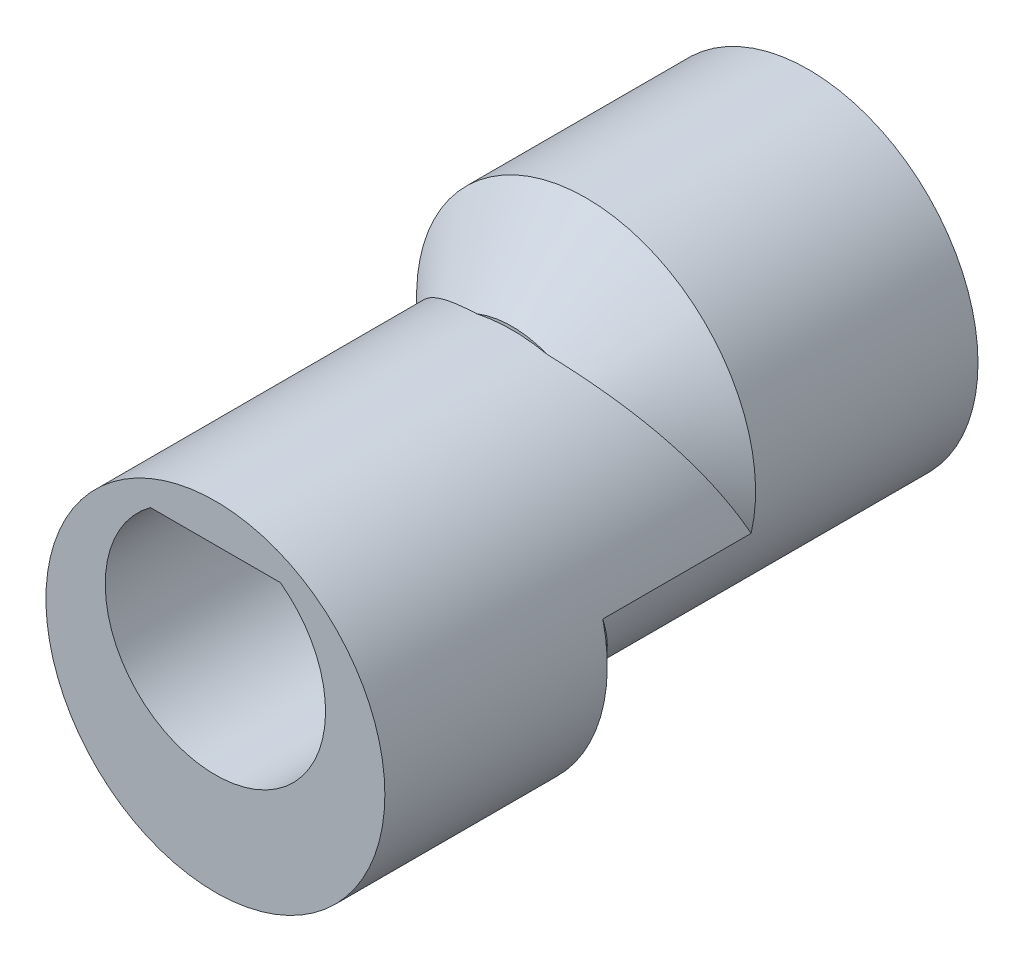
ISO-10303-21;
HEADER;
FILE_DESCRIPTION(('STEP AP214'),'2;1');
FILE_NAME('part.step','',(''),(''),'','','');
FILE_SCHEMA(('AUTOMOTIVE_DESIGN { 1 0 10303 214 1 1 1 1 }'));
ENDSEC;
DATA;
#1=APPLICATION_CONTEXT('core data for automotive mechanical design processes');
#2=APPLICATION_PROTOCOL_DEFINITION('international standard','automotive_design',2000,#1);
#3=PRODUCT_CONTEXT('',#1,'mechanical');
#4=PRODUCT('Part','Part','',(#3));
#5=PRODUCT_RELATED_PRODUCT_CATEGORY('part','',(#4));
#6=PRODUCT_DEFINITION_FORMATION('','',#4);
#7=PRODUCT_DEFINITION_CONTEXT('part definition',#1,'design');
#8=PRODUCT_DEFINITION('design','',#6,#7);
#9=PRODUCT_DEFINITION_SHAPE('','',#8);
#10=(LENGTH_UNIT() NAMED_UNIT(*) SI_UNIT(.MILLI.,.METRE.));
#11=(NAMED_UNIT(*) PLANE_ANGLE_UNIT() SI_UNIT($,.RADIAN.));
#12=(NAMED_UNIT(*) SI_UNIT($,.STERADIAN.) SOLID_ANGLE_UNIT());
#13=UNCERTAINTY_MEASURE_WITH_UNIT(LENGTH_MEASURE(1.E-05),#10,'distance_accuracy_value','');
#14=(GEOMETRIC_REPRESENTATION_CONTEXT(3) GLOBAL_UNCERTAINTY_ASSIGNED_CONTEXT((#13)) GLOBAL_UNIT_ASSIGNED_CONTEXT((#10,
#11,#12)) REPRESENTATION_CONTEXT('',''));
#15=CARTESIAN_POINT('',(0.,0.,0.));
#16=DIRECTION('',(0.,0.,1.));
#17=DIRECTION('',(1.,0.,0.));
#18=AXIS2_PLACEMENT_3D('',#15,#16,#17);
#19=CARTESIAN_POINT('',(0.,0.822072072072072,7.));
#20=DIRECTION('',(0.,0.,-1.));
#21=DIRECTION('',(-1.,0.,0.));
#22=AXIS2_PLACEMENT_3D('',#19,#20,#21);
#23=CYLINDRICAL_SURFACE('',#22,4.);
#24=CARTESIAN_POINT('',(0.,0.822072072072072,7.));
#25=DIRECTION('',(0.,0.,1.));
#26=DIRECTION('',(1.,0.,0.));
#27=AXIS2_PLACEMENT_3D('',#24,#25,#26);
#28=CIRCLE('',#27,4.);
#29=CARTESIAN_POINT('',(-0.832416826561857,-3.09035456965,7.));
#30=VERTEX_POINT('',#29);
#31=CARTESIAN_POINT('',(0.832416826561857,-3.09035456965,7.));
#32=VERTEX_POINT('',#31);
#33=EDGE_CURVE('E126',#30,#32,#28,.T.);
#34=ORIENTED_EDGE('',*,*,#33,.F.);
#35=CARTESIAN_POINT('',(-0.832416826561859,-3.09035456965,7.));
#36=CARTESIAN_POINT('',(-0.928283112962649,-3.06996119736182,7.01651059702666));
#37=CARTESIAN_POINT('',(-1.02289258695509,-3.04614512237589,7.03561942137898));
#38=CARTESIAN_POINT('',(-1.20909359386115,-2.9920435632729,7.07835176839966));
#39=CARTESIAN_POINT('',(-1.30068814168173,-2.96176478361378,7.10197060968749));
#40=CARTESIAN_POINT('',(-1.56947440841262,-2.86209877848865,7.17834381647651));
#41=CARTESIAN_POINT('',(-1.74175685502727,-2.78364402787083,7.23681585373251));
#42=CARTESIAN_POINT('',(-2.0779143594082,-2.60144986224845,7.36697500086163));
#43=CARTESIAN_POINT('',(-2.24106500081024,-2.49673363584971,7.43913745432706));
#44=CARTESIAN_POINT('',(-2.54883249725891,-2.26668666188954,7.59074588528036));
#45=CARTESIAN_POINT('',(-2.69341002483402,-2.14131341424269,7.67020672622366));
#46=CARTESIAN_POINT('',(-2.98907543887914,-1.84577692198815,7.84959275576821));
#47=CARTESIAN_POINT('',(-3.1356802439645,-1.67167082236258,7.95043192755659));
#48=CARTESIAN_POINT('',(-3.39684252708479,-1.30220910340953,8.15428576356132));
#49=CARTESIAN_POINT('',(-3.51142019835684,-1.10686698189474,8.25729901274184));
#50=CARTESIAN_POINT('',(-3.67088036612868,-0.773360208952291,8.42563317432922));
#51=CARTESIAN_POINT('',(-3.72598282228731,-0.640063734032256,8.49111344983434));
#52=CARTESIAN_POINT('',(-3.82151563065921,-0.368199923437119,8.62126290483657));
#53=CARTESIAN_POINT('',(-3.86196748324567,-0.229640644049144,8.68593313734113));
#54=CARTESIAN_POINT('',(-3.89487013147342,-0.088963963963964,8.75));
#55=B_SPLINE_CURVE_WITH_KNOTS('',3,(#35,#36,#37,#38,#39,#40,#41,#42,#43,#44,#45,#46,#47,#48,#49,
#50,#51,#52,#53,#54),.UNSPECIFIED.,.F.,.F.,(4,2,2,2,2,2,2,2,2,4),(0.,0.297945292975673,
0.595582984689978,1.18750437414797,1.805993153621,2.42577068629197,3.16952850456355,
3.91281631729058,4.38731643902962,4.86111736304012),.UNSPECIFIED.);
#56=CARTESIAN_POINT('',(-3.89487013147342,-0.0889639639639639,8.75));
#57=VERTEX_POINT('',#56);
#58=EDGE_CURVE('E11',#30,#57,#55,.T.);
#59=ORIENTED_EDGE('',*,*,#58,.T.);
#60=DIRECTION('',(0.,0.,-1.));
#61=VECTOR('',#60,1.);
#62=CARTESIAN_POINT('',(-3.89487013147342,-0.0889639639639639,7.));
#63=LINE('',#62,#61);
#64=CARTESIAN_POINT('',(-3.89487013147342,-0.0889639639639639,5.25));
#65=VERTEX_POINT('',#64);
#66=EDGE_CURVE('E138',#57,#65,#63,.T.);
#67=ORIENTED_EDGE('',*,*,#66,.T.);
#68=CARTESIAN_POINT('',(0.,0.822072072072072,5.25));
#69=DIRECTION('',(0.,0.,1.));
#70=DIRECTION('',(1.,0.,0.));
#71=AXIS2_PLACEMENT_3D('',#68,#69,#70);
#72=CIRCLE('',#71,4.);
#73=CARTESIAN_POINT('',(3.89487013147342,-0.0889639639639639,5.25));
#74=VERTEX_POINT('',#73);
#75=EDGE_CURVE('E135',#65,#74,#72,.F.);
#76=ORIENTED_EDGE('',*,*,#75,.T.);
#77=DIRECTION('',(0.,0.,-1.));
#78=VECTOR('',#77,1.);
#79=CARTESIAN_POINT('',(3.89487013147342,-0.0889639639639639,5.25));
#80=LINE('',#79,#78);
#81=CARTESIAN_POINT('',(3.89487013147342,-0.0889639639639639,8.75));
#82=VERTEX_POINT('',#81);
#83=EDGE_CURVE('E133',#74,#82,#80,.F.);
#84=ORIENTED_EDGE('',*,*,#83,.T.);
#85=CARTESIAN_POINT('',(3.89487013147342,-0.0889639639639639,8.75));
#86=CARTESIAN_POINT('',(3.86671510700556,-0.20930511358178,8.695185950325));
#87=CARTESIAN_POINT('',(3.83305308898068,-0.328083131837898,8.63994832234659));
#88=CARTESIAN_POINT('',(3.75501638353348,-0.561781737687089,8.52889763527694));
#89=CARTESIAN_POINT('',(3.71064221893601,-0.676702513227862,8.47308460439647));
#90=CARTESIAN_POINT('',(3.56183423666266,-1.01474572989651,8.30510932270334));
#91=CARTESIAN_POINT('',(3.44175218227322,-1.23099123667768,8.1924826090431));
#92=CARTESIAN_POINT('',(3.1632482341429,-1.63861802406267,7.96951787937824));
#93=CARTESIAN_POINT('',(3.004794062874,-1.82997816241363,7.85918187553825));
#94=CARTESIAN_POINT('',(2.65264711808882,-2.18214495843101,7.64542303566663));
#95=CARTESIAN_POINT('',(2.45896550477505,-2.3429612596235,7.54199802435239));
#96=CARTESIAN_POINT('',(2.16639693700184,-2.5419908605226,7.40750387581899));
#97=CARTESIAN_POINT('',(2.08055864745726,-2.59576964782898,7.37032952379564));
#98=CARTESIAN_POINT('',(1.90409366313856,-2.69712779375485,7.29887037535157));
#99=CARTESIAN_POINT('',(1.81346667388939,-2.74470677049976,7.26458575696859));
#100=CARTESIAN_POINT('',(1.62805792650162,-2.83305385457416,7.19973318709954));
#101=CARTESIAN_POINT('',(1.53329002911455,-2.87384277029053,7.16915396172359));
#102=CARTESIAN_POINT('',(1.33976628553074,-2.94830717495983,7.11240256046847));
#103=CARTESIAN_POINT('',(1.24101319575274,-2.98198748354147,7.08622740109473));
#104=CARTESIAN_POINT('',(1.09000403222972,-3.02691140921662,7.05083397924406));
#105=CARTESIAN_POINT('',(1.03903129482042,-3.04098683989311,7.03965354272527));
#106=CARTESIAN_POINT('',(0.936297584227293,-3.06716389036262,7.01872627941883));
#107=CARTESIAN_POINT('',(0.884536696254955,-3.0792657218992,7.00897929884956));
#108=CARTESIAN_POINT('',(0.832416826561863,-3.09035456965,6.99999999999998));
#109=B_SPLINE_CURVE_WITH_KNOTS('',3,(#85,#86,#87,#88,#89,#90,#91,#92,#93,#94,#95,#96,#97,#98,
#99,#100,#101,#102,#103,#104,#105,#106,#107,#108),.UNSPECIFIED.,.F.,.F.,(4,2,2,2,2,2,2,2,2,2,2,
4),(0.,0.405339054933944,0.81065833059254,1.6218221294166,2.43367064072074,3.24526240155843,
3.56872160205691,3.89220071647291,4.21466950204085,4.53691894673024,4.69901383965477,
4.86109133028042),.UNSPECIFIED.);
#110=EDGE_CURVE('E50',#82,#32,#109,.T.);
#111=ORIENTED_EDGE('',*,*,#110,.T.);
#112=EDGE_LOOP('',(#34,#59,#67,#76,#84,#111));
#113=FACE_BOUND('',#112,.T.);
#114=CARTESIAN_POINT('',(0.,0.822072072072072,0.));
#115=DIRECTION('',(0.,0.,1.));
#116=DIRECTION('',(1.,0.,0.));
#117=AXIS2_PLACEMENT_3D('',#114,#115,#116);
#118=CIRCLE('',#117,4.);
#119=CARTESIAN_POINT('',(4.,0.822072072072072,0.));
#120=VERTEX_POINT('',#119);
#121=EDGE_CURVE('E123',#120,#120,#118,.T.);
#122=ORIENTED_EDGE('',*,*,#121,.T.);
#123=EDGE_LOOP('',(#122));
#124=FACE_BOUND('',#123,.T.);
#125=ADVANCED_FACE('F35',(#113,#124),#23,.T.);
#126=CARTESIAN_POINT('',(0.,0.822072072072072,7.));
#127=DIRECTION('',(0.,0.,1.));
#128=DIRECTION('',(1.,0.,0.));
#129=AXIS2_PLACEMENT_3D('',#126,#127,#128);
#130=PLANE('',#129);
#131=CARTESIAN_POINT('',(0.,-1.,7.));
#132=DIRECTION('',(0.,0.,1.));
#133=DIRECTION('',(1.,0.,0.));
#134=AXIS2_PLACEMENT_3D('',#131,#132,#133);
#135=CIRCLE('',#134,4.);
#136=CARTESIAN_POINT('',(0.83241682656191,2.91242664172207,7.));
#137=VERTEX_POINT('',#136);
#138=CARTESIAN_POINT('',(-0.83241682656191,2.91242664172207,7.));
#139=VERTEX_POINT('',#138);
#140=EDGE_CURVE('E118',#137,#139,#135,.T.);
#141=ORIENTED_EDGE('',*,*,#140,.F.);
#142=CARTESIAN_POINT('',(0.,0.822072072072072,7.));
#143=DIRECTION('',(0.,0.,1.));
#144=DIRECTION('',(1.,0.,0.));
#145=AXIS2_PLACEMENT_3D('',#142,#143,#144);
#146=CIRCLE('',#145,2.25);
#147=EDGE_CURVE('E128',#137,#139,#146,.T.);
#148=ORIENTED_EDGE('',*,*,#147,.T.);
#149=EDGE_LOOP('',(#141,#148));
#150=FACE_BOUND('',#149,.T.);
#151=ADVANCED_FACE('F169',(#150),#130,.T.);
#152=CARTESIAN_POINT('',(0.,0.822072072072072,0.));
#153=DIRECTION('',(0.,0.,1.));
#154=DIRECTION('',(1.,0.,0.));
#155=AXIS2_PLACEMENT_3D('',#152,#153,#154);
#156=PLANE('',#155);
#157=DIRECTION('',(-1.,0.,0.));
#158=VECTOR('',#157,1.);
#159=CARTESIAN_POINT('',(-1.53297097167559,2.1,0.));
#160=LINE('',#159,#158);
#161=CARTESIAN_POINT('',(1.53297097167559,2.1,0.));
#162=VERTEX_POINT('',#161);
#163=CARTESIAN_POINT('',(-1.53297097167559,2.1,0.));
#164=VERTEX_POINT('',#163);
#165=EDGE_CURVE('E105',#162,#164,#160,.T.);
#166=ORIENTED_EDGE('',*,*,#165,.T.);
#167=CARTESIAN_POINT('',(0.,0.,0.));
#168=DIRECTION('',(0.,0.,1.));
#169=DIRECTION('',(1.,0.,0.));
#170=AXIS2_PLACEMENT_3D('',#167,#168,#169);
#171=CIRCLE('',#170,2.6);
#172=EDGE_CURVE('E97',#164,#162,#171,.T.);
#173=ORIENTED_EDGE('',*,*,#172,.T.);
#174=EDGE_LOOP('',(#166,#173));
#175=FACE_BOUND('',#174,.T.);
#176=ORIENTED_EDGE('',*,*,#121,.F.);
#177=EDGE_LOOP('',(#176));
#178=FACE_BOUND('',#177,.T.);
#179=ADVANCED_FACE('F111',(#175,#178),#156,.F.);
#180=CARTESIAN_POINT('',(0.,-1.,7.));
#181=DIRECTION('',(0.,0.,1.));
#182=DIRECTION('',(1.,0.,0.));
#183=AXIS2_PLACEMENT_3D('',#180,#181,#182);
#184=PLANE('',#183);
#185=ORIENTED_EDGE('',*,*,#33,.T.);
#186=CARTESIAN_POINT('',(0.,-1.,7.));
#187=DIRECTION('',(0.,0.,1.));
#188=DIRECTION('',(1.,0.,0.));
#189=AXIS2_PLACEMENT_3D('',#186,#187,#188);
#190=CIRCLE('',#189,2.24999999999999);
#191=EDGE_CURVE('E62',#32,#30,#190,.F.);
#192=ORIENTED_EDGE('',*,*,#191,.T.);
#193=EDGE_LOOP('',(#185,#192));
#194=FACE_BOUND('',#193,.T.);
#195=ADVANCED_FACE('F224',(#194),#184,.F.);
#196=CARTESIAN_POINT('',(0.,-1.,14.));
#197=DIRECTION('',(0.,0.,-1.));
#198=DIRECTION('',(-1.,0.,0.));
#199=AXIS2_PLACEMENT_3D('',#196,#197,#198);
#200=CYLINDRICAL_SURFACE('',#199,4.);
#201=CARTESIAN_POINT('',(0.,-1.,14.));
#202=DIRECTION('',(0.,0.,1.));
#203=DIRECTION('',(1.,0.,0.));
#204=AXIS2_PLACEMENT_3D('',#201,#202,#203);
#205=CIRCLE('',#204,4.);
#206=CARTESIAN_POINT('',(4.,-1.,14.));
#207=VERTEX_POINT('',#206);
#208=EDGE_CURVE('E120',#207,#207,#205,.T.);
#209=ORIENTED_EDGE('',*,*,#208,.F.);
#210=EDGE_LOOP('',(#209));
#211=FACE_BOUND('',#210,.T.);
#212=CARTESIAN_POINT('',(0.,-1.,8.75));
#213=DIRECTION('',(0.,0.,1.));
#214=DIRECTION('',(1.,0.,0.));
#215=AXIS2_PLACEMENT_3D('',#212,#213,#214);
#216=CIRCLE('',#215,4.);
#217=EDGE_CURVE('E176',#57,#82,#216,.T.);
#218=ORIENTED_EDGE('',*,*,#217,.T.);
#219=ORIENTED_EDGE('',*,*,#83,.F.);
#220=CARTESIAN_POINT('',(3.89487013147342,-0.0889639639639639,5.25));
#221=CARTESIAN_POINT('',(3.86671510700556,0.0313771856538526,5.30481404967499));
#222=CARTESIAN_POINT('',(3.83305308898068,0.15015520390997,5.36005167765341));
#223=CARTESIAN_POINT('',(3.75501638353348,0.383853809759161,5.47110236472306));
#224=CARTESIAN_POINT('',(3.71064221893601,0.498774585299935,5.52691539560353));
#225=CARTESIAN_POINT('',(3.56183423666265,0.836817801968578,5.69489067729666));
#226=CARTESIAN_POINT('',(3.44175218227322,1.05306330874975,5.8075173909569));
#227=CARTESIAN_POINT('',(3.1632482341429,1.46069009613475,6.03048212062176));
#228=CARTESIAN_POINT('',(3.00479406287399,1.65205023448571,6.14081812446175));
#229=CARTESIAN_POINT('',(2.65264711808882,2.00421703050309,6.35457696433337));
#230=CARTESIAN_POINT('',(2.45896550477505,2.16503333169557,6.45800197564762));
#231=CARTESIAN_POINT('',(2.16639693700183,2.36406293259467,6.59249612418102));
#232=CARTESIAN_POINT('',(2.08055864745725,2.41784171990105,6.62967047620436));
#233=CARTESIAN_POINT('',(1.90409366313856,2.51919986582692,6.70112962464844));
#234=CARTESIAN_POINT('',(1.81346667388938,2.56677884257183,6.73541424303142));
#235=CARTESIAN_POINT('',(1.62805792650162,2.65512592664623,6.80026681290047));
#236=CARTESIAN_POINT('',(1.53329002911455,2.6959148423626,6.83084603827642));
#237=CARTESIAN_POINT('',(1.33976628553074,2.77037924703191,6.88759743953154));
#238=CARTESIAN_POINT('',(1.24101319575273,2.80405955561355,6.91377259890528));
#239=CARTESIAN_POINT('',(1.09000403222972,2.84898348128869,6.94916602075595));
#240=CARTESIAN_POINT('',(1.03903129482043,2.86305891196518,6.96034645727474));
#241=CARTESIAN_POINT('',(0.936297584227324,2.88923596243468,6.98127372058117));
#242=CARTESIAN_POINT('',(0.884536696254996,2.90133779397126,6.99102070115045));
#243=CARTESIAN_POINT('',(0.832416826561914,2.91242664172207,7.00000000000002));
#244=B_SPLINE_CURVE_WITH_KNOTS('',3,(#220,#221,#222,#223,#224,#225,#226,#227,#228,#229,#230,
#231,#232,#233,#234,#235,#236,#237,#238,#239,#240,#241,#242,#243),.UNSPECIFIED.,.F.,.F.,(4,2,2,
2,2,2,2,2,2,2,2,4),(0.,0.405339054933944,0.810658330592541,1.62182212941661,2.43367064072074,
3.24526240155844,3.56872160205692,3.89220071647292,4.21466950204086,4.53691894673026,
4.69901383965475,4.86109133028037),.UNSPECIFIED.);
#245=EDGE_CURVE('E148',#74,#137,#244,.T.);
#246=ORIENTED_EDGE('',*,*,#245,.T.);
#247=ORIENTED_EDGE('',*,*,#140,.T.);
#248=CARTESIAN_POINT('',(-0.83241682656191,2.91242664172207,7.));
#249=CARTESIAN_POINT('',(-0.9282831129627,2.89203326943388,6.98348940297334));
#250=CARTESIAN_POINT('',(-1.02289258695514,2.86821719444795,6.96438057862102));
#251=CARTESIAN_POINT('',(-1.2090935938612,2.81411563534495,6.92164823160034));
#252=CARTESIAN_POINT('',(-1.30068814168178,2.78383685568583,6.8980293903125));
#253=CARTESIAN_POINT('',(-1.56947440841267,2.68417085056069,6.82165618352348));
#254=CARTESIAN_POINT('',(-1.74175685502733,2.60571609994288,6.76318414626748));
#255=CARTESIAN_POINT('',(-2.07791435940826,2.42352193432049,6.63302499913835));
#256=CARTESIAN_POINT('',(-2.24106500081029,2.31880570792175,6.56086254567292));
#257=CARTESIAN_POINT('',(-2.54883249725896,2.08875873396157,6.40925411471962));
#258=CARTESIAN_POINT('',(-2.69341002483407,1.96338548631471,6.32979327377632));
#259=CARTESIAN_POINT('',(-2.98907543887919,1.66784899406017,6.15040724423176));
#260=CARTESIAN_POINT('',(-3.13568024396454,1.4937428944346,6.04956807244338));
#261=CARTESIAN_POINT('',(-3.39684252708483,1.12428117548154,5.84571423643864));
#262=CARTESIAN_POINT('',(-3.51142019835687,0.928939053966743,5.74270098725813));
#263=CARTESIAN_POINT('',(-3.6708803661287,0.595432281024306,5.57436682567075));
#264=CARTESIAN_POINT('',(-3.72598282228733,0.462135806104281,5.50888655016564));
#265=CARTESIAN_POINT('',(-3.82151563065922,0.190271995509168,5.37873709516342));
#266=CARTESIAN_POINT('',(-3.86196748324567,0.0517127161212047,5.31406686265886));
#267=CARTESIAN_POINT('',(-3.89487013147342,-0.0889639639639637,5.25));
#268=B_SPLINE_CURVE_WITH_KNOTS('',3,(#248,#249,#250,#251,#252,#253,#254,#255,#256,#257,#258,
#259,#260,#261,#262,#263,#264,#265,#266,#267),.UNSPECIFIED.,.F.,.F.,(4,2,2,2,2,2,2,2,2,4),(0.,
0.297945292975674,0.595582984689982,1.18750437414798,1.80599315362102,2.42577068629199,
3.16952850456358,3.91281631729061,4.38731643902961,4.86111736304007),.UNSPECIFIED.);
#269=EDGE_CURVE('E141',#139,#65,#268,.T.);
#270=ORIENTED_EDGE('',*,*,#269,.T.);
#271=ORIENTED_EDGE('',*,*,#66,.F.);
#272=EDGE_LOOP('',(#218,#219,#246,#247,#270,#271));
#273=FACE_BOUND('',#272,.T.);
#274=ADVANCED_FACE('F154',(#211,#273),#200,.T.);
#275=CARTESIAN_POINT('',(0.,-1.,14.));
#276=DIRECTION('',(0.,0.,1.));
#277=DIRECTION('',(1.,0.,0.));
#278=AXIS2_PLACEMENT_3D('',#275,#276,#277);
#279=PLANE('',#278);
#280=CARTESIAN_POINT('',(0.,0.,14.));
#281=DIRECTION('',(0.,0.,1.));
#282=DIRECTION('',(1.,0.,0.));
#283=AXIS2_PLACEMENT_3D('',#280,#281,#282);
#284=CIRCLE('',#283,2.6);
#285=CARTESIAN_POINT('',(-1.53297097167559,2.1,14.));
#286=VERTEX_POINT('',#285);
#287=CARTESIAN_POINT('',(1.53297097167559,2.1,14.));
#288=VERTEX_POINT('',#287);
#289=EDGE_CURVE('E100',#286,#288,#284,.T.);
#290=ORIENTED_EDGE('',*,*,#289,.F.);
#291=DIRECTION('',(-1.,0.,0.));
#292=VECTOR('',#291,1.);
#293=CARTESIAN_POINT('',(-1.53297097167559,2.1,14.));
#294=LINE('',#293,#292);
#295=EDGE_CURVE('E113',#288,#286,#294,.T.);
#296=ORIENTED_EDGE('',*,*,#295,.F.);
#297=EDGE_LOOP('',(#290,#296));
#298=FACE_BOUND('',#297,.T.);
#299=ORIENTED_EDGE('',*,*,#208,.T.);
#300=EDGE_LOOP('',(#299));
#301=FACE_BOUND('',#300,.T.);
#302=ADVANCED_FACE('F210',(#298,#301),#279,.T.);
#303=CARTESIAN_POINT('',(0.,0.,0.));
#304=DIRECTION('',(0.,0.,1.));
#305=DIRECTION('',(1.,0.,0.));
#306=AXIS2_PLACEMENT_3D('',#303,#304,#305);
#307=CYLINDRICAL_SURFACE('',#306,2.6);
#308=ORIENTED_EDGE('',*,*,#289,.T.);
#309=DIRECTION('',(0.,0.,1.));
#310=VECTOR('',#309,1.);
#311=CARTESIAN_POINT('',(1.53297097167559,2.1,0.));
#312=LINE('',#311,#310);
#313=EDGE_CURVE('E93',#162,#288,#312,.T.);
#314=ORIENTED_EDGE('',*,*,#313,.F.);
#315=ORIENTED_EDGE('',*,*,#172,.F.);
#316=DIRECTION('',(0.,0.,1.));
#317=VECTOR('',#316,1.);
#318=CARTESIAN_POINT('',(-1.53297097167559,2.1,0.));
#319=LINE('',#318,#317);
#320=EDGE_CURVE('E104',#164,#286,#319,.T.);
#321=ORIENTED_EDGE('',*,*,#320,.T.);
#322=EDGE_LOOP('',(#308,#314,#315,#321));
#323=FACE_BOUND('',#322,.T.);
#324=ADVANCED_FACE('F95',(#323),#307,.F.);
#325=CARTESIAN_POINT('',(-1.53297097167559,2.1,0.));
#326=DIRECTION('',(0.,1.,0.));
#327=DIRECTION('',(0.,0.,1.));
#328=AXIS2_PLACEMENT_3D('',#325,#326,#327);
#329=PLANE('',#328);
#330=ORIENTED_EDGE('',*,*,#295,.T.);
#331=ORIENTED_EDGE('',*,*,#320,.F.);
#332=ORIENTED_EDGE('',*,*,#165,.F.);
#333=ORIENTED_EDGE('',*,*,#313,.T.);
#334=EDGE_LOOP('',(#330,#331,#332,#333));
#335=FACE_BOUND('',#334,.T.);
#336=ADVANCED_FACE('F108',(#335),#329,.F.);
#337=CARTESIAN_POINT('',(0.,0.822072072072072,7.));
#338=DIRECTION('',(0.,0.,-1.));
#339=DIRECTION('',(-1.,0.,0.));
#340=AXIS2_PLACEMENT_3D('',#337,#338,#339);
#341=CONICAL_SURFACE('',#340,2.25,0.785398163397446);
#342=ORIENTED_EDGE('',*,*,#245,.F.);
#343=ORIENTED_EDGE('',*,*,#75,.F.);
#344=ORIENTED_EDGE('',*,*,#269,.F.);
#345=ORIENTED_EDGE('',*,*,#147,.F.);
#346=EDGE_LOOP('',(#342,#343,#344,#345));
#347=FACE_BOUND('',#346,.T.);
#348=ADVANCED_FACE('F159',(#347),#341,.T.);
#349=CARTESIAN_POINT('',(0.,-1.,8.75));
#350=DIRECTION('',(0.,0.,1.));
#351=DIRECTION('',(1.,0.,0.));
#352=AXIS2_PLACEMENT_3D('',#349,#350,#351);
#353=CONICAL_SURFACE('',#352,4.,0.78539816339745);
#354=ORIENTED_EDGE('',*,*,#58,.F.);
#355=ORIENTED_EDGE('',*,*,#191,.F.);
#356=ORIENTED_EDGE('',*,*,#110,.F.);
#357=ORIENTED_EDGE('',*,*,#217,.F.);
#358=EDGE_LOOP('',(#354,#355,#356,#357));
#359=FACE_BOUND('',#358,.T.);
#360=ADVANCED_FACE('F38',(#359),#353,.T.);
#361=CLOSED_SHELL('',(#125,#151,#179,#195,#274,#302,#324,#336,#348,#360));
#362=MANIFOLD_SOLID_BREP('B2',#361);
#363=ADVANCED_BREP_SHAPE_REPRESENTATION('',(#18,#362),#14);
#364=SHAPE_DEFINITION_REPRESENTATION(#9,#363);
ENDSEC;
END-ISO-10303-21;
